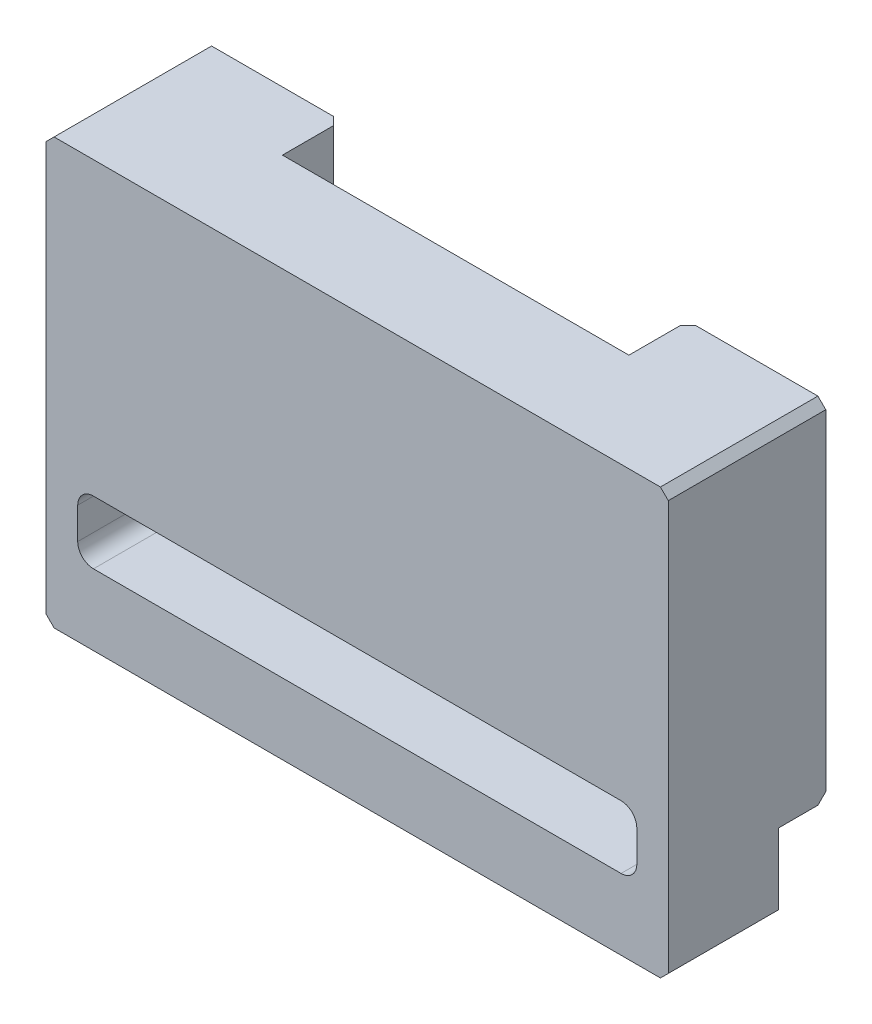
ISO-10303-21;
HEADER;
FILE_DESCRIPTION(('STEP AP214'),'2;1');
FILE_NAME('part.step','',(''),(''),'','','');
FILE_SCHEMA(('AUTOMOTIVE_DESIGN { 1 0 10303 214 1 1 1 1 }'));
ENDSEC;
DATA;
#1=APPLICATION_CONTEXT('core data for automotive mechanical design processes');
#2=APPLICATION_PROTOCOL_DEFINITION('international standard','automotive_design',2000,#1);
#3=PRODUCT_CONTEXT('',#1,'mechanical');
#4=PRODUCT('Part','Part','',(#3));
#5=PRODUCT_RELATED_PRODUCT_CATEGORY('part','',(#4));
#6=PRODUCT_DEFINITION_FORMATION('','',#4);
#7=PRODUCT_DEFINITION_CONTEXT('part definition',#1,'design');
#8=PRODUCT_DEFINITION('design','',#6,#7);
#9=PRODUCT_DEFINITION_SHAPE('','',#8);
#10=(LENGTH_UNIT() NAMED_UNIT(*) SI_UNIT(.MILLI.,.METRE.));
#11=(NAMED_UNIT(*) PLANE_ANGLE_UNIT() SI_UNIT($,.RADIAN.));
#12=(NAMED_UNIT(*) SI_UNIT($,.STERADIAN.) SOLID_ANGLE_UNIT());
#13=UNCERTAINTY_MEASURE_WITH_UNIT(LENGTH_MEASURE(1.E-05),#10,'distance_accuracy_value','');
#14=(GEOMETRIC_REPRESENTATION_CONTEXT(3) GLOBAL_UNCERTAINTY_ASSIGNED_CONTEXT((#13)) GLOBAL_UNIT_ASSIGNED_CONTEXT((#10,
#11,#12)) REPRESENTATION_CONTEXT('',''));
#15=CARTESIAN_POINT('',(0.,0.,0.));
#16=DIRECTION('',(0.,0.,1.));
#17=DIRECTION('',(1.,0.,0.));
#18=AXIS2_PLACEMENT_3D('',#15,#16,#17);
#19=CARTESIAN_POINT('',(0.,0.,-15.));
#20=DIRECTION('',(0.,0.,1.));
#21=DIRECTION('',(1.,0.,0.));
#22=AXIS2_PLACEMENT_3D('',#19,#20,#21);
#23=PLANE('',#22);
#24=DIRECTION('',(0.,1.,0.));
#25=VECTOR('',#24,1.);
#26=CARTESIAN_POINT('',(-56.5,-32.,-15.));
#27=LINE('',#26,#25);
#28=CARTESIAN_POINT('',(-56.5,-38.,-15.));
#29=VERTEX_POINT('',#28);
#30=CARTESIAN_POINT('',(-56.5,-34.,-15.));
#31=VERTEX_POINT('',#30);
#32=EDGE_CURVE('E292',#29,#31,#27,.T.);
#33=ORIENTED_EDGE('',*,*,#32,.F.);
#34=DIRECTION('',(-1.,0.,0.));
#35=VECTOR('',#34,1.);
#36=CARTESIAN_POINT('',(0.,-38.,-15.));
#37=LINE('',#36,#35);
#38=CARTESIAN_POINT('',(-60.5,-38.,-15.));
#39=VERTEX_POINT('',#38);
#40=EDGE_CURVE('E437',#29,#39,#37,.T.);
#41=ORIENTED_EDGE('',*,*,#40,.T.);
#42=DIRECTION('',(0.,-1.,0.));
#43=VECTOR('',#42,1.);
#44=CARTESIAN_POINT('',(-60.5,5.00000000000002,-15.));
#45=LINE('',#44,#43);
#46=CARTESIAN_POINT('',(-60.5,4.,-15.));
#47=VERTEX_POINT('',#46);
#48=EDGE_CURVE('E312',#47,#39,#45,.T.);
#49=ORIENTED_EDGE('',*,*,#48,.F.);
#50=DIRECTION('',(-0.707106781186548,-0.707106781186548,0.));
#51=VECTOR('',#50,1.);
#52=CARTESIAN_POINT('',(-59.5,5.00000000000002,-15.));
#53=LINE('',#52,#51);
#54=CARTESIAN_POINT('',(-59.5,5.00000000000002,-15.));
#55=VERTEX_POINT('',#54);
#56=EDGE_CURVE('E428',#47,#55,#53,.F.);
#57=ORIENTED_EDGE('',*,*,#56,.T.);
#58=DIRECTION('',(-1.,0.,0.));
#59=VECTOR('',#58,1.);
#60=CARTESIAN_POINT('',(-60.5,5.00000000000002,-15.));
#61=LINE('',#60,#59);
#62=CARTESIAN_POINT('',(-44.,5.00000000000002,-15.));
#63=VERTEX_POINT('',#62);
#64=EDGE_CURVE('E317',#63,#55,#61,.T.);
#65=ORIENTED_EDGE('',*,*,#64,.F.);
#66=DIRECTION('',(0.,-1.,0.));
#67=VECTOR('',#66,1.);
#68=CARTESIAN_POINT('',(-44.,0.,-15.));
#69=LINE('',#68,#67);
#70=CARTESIAN_POINT('',(-44.,-32.,-15.));
#71=VERTEX_POINT('',#70);
#72=EDGE_CURVE('E392',#63,#71,#69,.T.);
#73=ORIENTED_EDGE('',*,*,#72,.T.);
#74=DIRECTION('',(1.,0.,0.));
#75=VECTOR('',#74,1.);
#76=CARTESIAN_POINT('',(14.5,-32.,-15.));
#77=LINE('',#76,#75);
#78=CARTESIAN_POINT('',(-54.5,-32.,-15.));
#79=VERTEX_POINT('',#78);
#80=EDGE_CURVE('E296',#79,#71,#77,.T.);
#81=ORIENTED_EDGE('',*,*,#80,.F.);
#82=CARTESIAN_POINT('',(-54.5,-34.,-15.));
#83=DIRECTION('',(0.,0.,1.));
#84=DIRECTION('',(1.,0.,0.));
#85=AXIS2_PLACEMENT_3D('',#82,#83,#84);
#86=CIRCLE('',#85,2.);
#87=EDGE_CURVE('E354',#79,#31,#86,.T.);
#88=ORIENTED_EDGE('',*,*,#87,.T.);
#89=EDGE_LOOP('',(#33,#41,#49,#57,#65,#73,#81,#88));
#90=FACE_BOUND('',#89,.T.);
#91=ADVANCED_FACE('F33',(#90),#23,.F.);
#92=CARTESIAN_POINT('',(18.5,-39.,-14.));
#93=DIRECTION('',(0.,1.,0.));
#94=DIRECTION('',(0.,0.,1.));
#95=AXIS2_PLACEMENT_3D('',#92,#93,#94);
#96=PLANE('',#95);
#97=DIRECTION('',(0.,0.,-1.));
#98=VECTOR('',#97,1.);
#99=CARTESIAN_POINT('',(14.752065001221,-39.,-14.));
#100=LINE('',#99,#98);
#101=CARTESIAN_POINT('',(14.752065001221,-39.,-9.));
#102=VERTEX_POINT('',#101);
#103=CARTESIAN_POINT('',(14.752065001221,-39.,-14.));
#104=VERTEX_POINT('',#103);
#105=EDGE_CURVE('E362',#102,#104,#100,.T.);
#106=ORIENTED_EDGE('',*,*,#105,.T.);
#107=DIRECTION('',(1.,0.,0.));
#108=VECTOR('',#107,1.);
#109=CARTESIAN_POINT('',(18.5,-39.,-14.));
#110=LINE('',#109,#108);
#111=CARTESIAN_POINT('',(18.5,-39.,-14.));
#112=VERTEX_POINT('',#111);
#113=EDGE_CURVE('E241',#104,#112,#110,.T.);
#114=ORIENTED_EDGE('',*,*,#113,.T.);
#115=DIRECTION('',(0.,0.,-1.));
#116=VECTOR('',#115,1.);
#117=CARTESIAN_POINT('',(18.5,-39.,-14.));
#118=LINE('',#117,#116);
#119=CARTESIAN_POINT('',(18.5,-39.,-9.));
#120=VERTEX_POINT('',#119);
#121=EDGE_CURVE('E238',#120,#112,#118,.T.);
#122=ORIENTED_EDGE('',*,*,#121,.F.);
#123=DIRECTION('',(1.,0.,0.));
#124=VECTOR('',#123,1.);
#125=CARTESIAN_POINT('',(14.5,-39.,-9.));
#126=LINE('',#125,#124);
#127=EDGE_CURVE('E223',#102,#120,#126,.T.);
#128=ORIENTED_EDGE('',*,*,#127,.F.);
#129=EDGE_LOOP('',(#106,#114,#122,#128));
#130=FACE_BOUND('',#129,.T.);
#131=ADVANCED_FACE('F239',(#130),#96,.F.);
#132=CARTESIAN_POINT('',(-60.5,5.00000000000002,-15.));
#133=DIRECTION('',(-1.,0.,0.));
#134=DIRECTION('',(0.,-1.,0.));
#135=AXIS2_PLACEMENT_3D('',#132,#133,#134);
#136=PLANE('',#135);
#137=ORIENTED_EDGE('',*,*,#48,.T.);
#138=DIRECTION('',(0.,0.707106781186552,-0.707106781186543));
#139=VECTOR('',#138,1.);
#140=CARTESIAN_POINT('',(-60.5,-16.4999999999997,-36.5));
#141=LINE('',#140,#139);
#142=CARTESIAN_POINT('',(-60.5,-39.,-14.));
#143=VERTEX_POINT('',#142);
#144=EDGE_CURVE('E439',#39,#143,#141,.F.);
#145=ORIENTED_EDGE('',*,*,#144,.T.);
#146=DIRECTION('',(0.,0.,-1.));
#147=VECTOR('',#146,1.);
#148=CARTESIAN_POINT('',(-60.5,-39.,-14.));
#149=LINE('',#148,#147);
#150=CARTESIAN_POINT('',(-60.5,-39.,-9.));
#151=VERTEX_POINT('',#150);
#152=EDGE_CURVE('E243',#151,#143,#149,.T.);
#153=ORIENTED_EDGE('',*,*,#152,.F.);
#154=DIRECTION('',(0.,1.,0.));
#155=VECTOR('',#154,1.);
#156=CARTESIAN_POINT('',(-60.5,-49.,-9.));
#157=LINE('',#156,#155);
#158=CARTESIAN_POINT('',(-60.5,-48.,-9.));
#159=VERTEX_POINT('',#158);
#160=EDGE_CURVE('E252',#159,#151,#157,.T.);
#161=ORIENTED_EDGE('',*,*,#160,.F.);
#162=DIRECTION('',(0.,0.,1.));
#163=VECTOR('',#162,1.);
#164=CARTESIAN_POINT('',(-60.5,-48.,-15.));
#165=LINE('',#164,#163);
#166=CARTESIAN_POINT('',(-60.5,-48.,5.));
#167=VERTEX_POINT('',#166);
#168=EDGE_CURVE('E423',#159,#167,#165,.T.);
#169=ORIENTED_EDGE('',*,*,#168,.T.);
#170=DIRECTION('',(0.,-1.,0.));
#171=VECTOR('',#170,1.);
#172=CARTESIAN_POINT('',(-60.5,5.00000000000002,5.));
#173=LINE('',#172,#171);
#174=CARTESIAN_POINT('',(-60.5,4.,5.));
#175=VERTEX_POINT('',#174);
#176=EDGE_CURVE('E242',#175,#167,#173,.T.);
#177=ORIENTED_EDGE('',*,*,#176,.F.);
#178=DIRECTION('',(0.,0.,-1.));
#179=VECTOR('',#178,1.);
#180=CARTESIAN_POINT('',(-60.5,4.,-15.));
#181=LINE('',#180,#179);
#182=EDGE_CURVE('E426',#175,#47,#181,.T.);
#183=ORIENTED_EDGE('',*,*,#182,.T.);
#184=EDGE_LOOP('',(#137,#145,#153,#161,#169,#177,#183));
#185=FACE_BOUND('',#184,.T.);
#186=ADVANCED_FACE('F527',(#185),#136,.T.);
#187=CARTESIAN_POINT('',(-60.5,5.00000000000002,-15.));
#188=DIRECTION('',(0.,1.,0.));
#189=DIRECTION('',(0.,0.,1.));
#190=AXIS2_PLACEMENT_3D('',#187,#188,#189);
#191=PLANE('',#190);
#192=DIRECTION('',(-1.,0.,0.));
#193=VECTOR('',#192,1.);
#194=CARTESIAN_POINT('',(-60.5,5.00000000000002,5.));
#195=LINE('',#194,#193);
#196=CARTESIAN_POINT('',(17.5,5.00000000000002,5.));
#197=VERTEX_POINT('',#196);
#198=CARTESIAN_POINT('',(-59.5,5.00000000000001,5.));
#199=VERTEX_POINT('',#198);
#200=EDGE_CURVE('E309',#197,#199,#195,.T.);
#201=ORIENTED_EDGE('',*,*,#200,.F.);
#202=DIRECTION('',(0.,0.,-1.));
#203=VECTOR('',#202,1.);
#204=CARTESIAN_POINT('',(17.5,5.00000000000002,-15.));
#205=LINE('',#204,#203);
#206=CARTESIAN_POINT('',(17.5,5.00000000000002,-15.));
#207=VERTEX_POINT('',#206);
#208=EDGE_CURVE('E409',#197,#207,#205,.T.);
#209=ORIENTED_EDGE('',*,*,#208,.T.);
#210=CARTESIAN_POINT('',(2.,5.00000000000002,-15.));
#211=VERTEX_POINT('',#210);
#212=EDGE_CURVE('E318',#207,#211,#61,.T.);
#213=ORIENTED_EDGE('',*,*,#212,.T.);
#214=DIRECTION('',(0.707106781186552,0.,-0.707106781186543));
#215=VECTOR('',#214,1.);
#216=CARTESIAN_POINT('',(-29.2500000000004,5.00000000000002,16.25));
#217=LINE('',#216,#215);
#218=CARTESIAN_POINT('',(1.,5.00000000000002,-14.));
#219=VERTEX_POINT('',#218);
#220=EDGE_CURVE('E387',#211,#219,#217,.F.);
#221=ORIENTED_EDGE('',*,*,#220,.T.);
#222=DIRECTION('',(0.,0.,1.));
#223=VECTOR('',#222,1.);
#224=CARTESIAN_POINT('',(1.,5.00000000000002,-15.));
#225=LINE('',#224,#223);
#226=CARTESIAN_POINT('',(1.,5.00000000000002,-7.5));
#227=VERTEX_POINT('',#226);
#228=EDGE_CURVE('E287',#219,#227,#225,.T.);
#229=ORIENTED_EDGE('',*,*,#228,.T.);
#230=DIRECTION('',(1.,0.,0.));
#231=VECTOR('',#230,1.);
#232=CARTESIAN_POINT('',(-43.,5.00000000000002,-7.5));
#233=LINE('',#232,#231);
#234=CARTESIAN_POINT('',(-43.,5.00000000000002,-7.5));
#235=VERTEX_POINT('',#234);
#236=EDGE_CURVE('E269',#235,#227,#233,.T.);
#237=ORIENTED_EDGE('',*,*,#236,.F.);
#238=DIRECTION('',(0.,0.,-1.));
#239=VECTOR('',#238,1.);
#240=CARTESIAN_POINT('',(-43.,5.00000000000002,-12.5));
#241=LINE('',#240,#239);
#242=CARTESIAN_POINT('',(-43.,5.00000000000002,-14.));
#243=VERTEX_POINT('',#242);
#244=EDGE_CURVE('E284',#235,#243,#241,.T.);
#245=ORIENTED_EDGE('',*,*,#244,.T.);
#246=DIRECTION('',(0.707106781186552,0.,0.707106781186543));
#247=VECTOR('',#246,1.);
#248=CARTESIAN_POINT('',(-52.2500000000001,5.00000000000002,-23.25));
#249=LINE('',#248,#247);
#250=EDGE_CURVE('E385',#243,#63,#249,.F.);
#251=ORIENTED_EDGE('',*,*,#250,.T.);
#252=ORIENTED_EDGE('',*,*,#64,.T.);
#253=DIRECTION('',(0.,0.,1.));
#254=VECTOR('',#253,1.);
#255=CARTESIAN_POINT('',(-59.5,5.00000000000002,-15.));
#256=LINE('',#255,#254);
#257=EDGE_CURVE('E406',#55,#199,#256,.T.);
#258=ORIENTED_EDGE('',*,*,#257,.T.);
#259=EDGE_LOOP('',(#201,#209,#213,#221,#229,#237,#245,#251,#252,#258));
#260=FACE_BOUND('',#259,.T.);
#261=ADVANCED_FACE('F499',(#260),#191,.T.);
#262=CARTESIAN_POINT('',(18.5,5.00000000000002,-15.));
#263=DIRECTION('',(1.,0.,0.));
#264=DIRECTION('',(0.,1.,0.));
#265=AXIS2_PLACEMENT_3D('',#262,#263,#264);
#266=PLANE('',#265);
#267=ORIENTED_EDGE('',*,*,#121,.T.);
#268=DIRECTION('',(0.,-0.707106781186552,0.707106781186543));
#269=VECTOR('',#268,1.);
#270=CARTESIAN_POINT('',(18.5,-16.4999999999997,-36.5));
#271=LINE('',#270,#269);
#272=CARTESIAN_POINT('',(18.5,-38.,-15.));
#273=VERTEX_POINT('',#272);
#274=EDGE_CURVE('E55',#112,#273,#271,.F.);
#275=ORIENTED_EDGE('',*,*,#274,.T.);
#276=DIRECTION('',(0.,1.,0.));
#277=VECTOR('',#276,1.);
#278=CARTESIAN_POINT('',(18.5,5.00000000000002,-15.));
#279=LINE('',#278,#277);
#280=CARTESIAN_POINT('',(18.5,4.00000000000002,-15.));
#281=VERTEX_POINT('',#280);
#282=EDGE_CURVE('E315',#273,#281,#279,.T.);
#283=ORIENTED_EDGE('',*,*,#282,.T.);
#284=DIRECTION('',(0.,0.,1.));
#285=VECTOR('',#284,1.);
#286=CARTESIAN_POINT('',(18.5,4.00000000000002,-15.));
#287=LINE('',#286,#285);
#288=CARTESIAN_POINT('',(18.5,4.00000000000001,5.));
#289=VERTEX_POINT('',#288);
#290=EDGE_CURVE('E395',#281,#289,#287,.T.);
#291=ORIENTED_EDGE('',*,*,#290,.T.);
#292=DIRECTION('',(0.,1.,0.));
#293=VECTOR('',#292,1.);
#294=CARTESIAN_POINT('',(18.5,5.00000000000002,5.));
#295=LINE('',#294,#293);
#296=CARTESIAN_POINT('',(18.5,-48.,5.));
#297=VERTEX_POINT('',#296);
#298=EDGE_CURVE('E306',#297,#289,#295,.T.);
#299=ORIENTED_EDGE('',*,*,#298,.F.);
#300=DIRECTION('',(0.,0.,-1.));
#301=VECTOR('',#300,1.);
#302=CARTESIAN_POINT('',(18.5,-48.,-15.));
#303=LINE('',#302,#301);
#304=CARTESIAN_POINT('',(18.5,-48.,-9.));
#305=VERTEX_POINT('',#304);
#306=EDGE_CURVE('E248',#297,#305,#303,.T.);
#307=ORIENTED_EDGE('',*,*,#306,.T.);
#308=DIRECTION('',(0.,-1.,0.));
#309=VECTOR('',#308,1.);
#310=CARTESIAN_POINT('',(18.5,-39.,-9.));
#311=LINE('',#310,#309);
#312=EDGE_CURVE('E227',#120,#305,#311,.T.);
#313=ORIENTED_EDGE('',*,*,#312,.F.);
#314=EDGE_LOOP('',(#267,#275,#283,#291,#299,#307,#313));
#315=FACE_BOUND('',#314,.T.);
#316=ADVANCED_FACE('F245',(#315),#266,.T.);
#317=CARTESIAN_POINT('',(-60.5,-49.,-15.));
#318=DIRECTION('',(0.,-1.,0.));
#319=DIRECTION('',(0.,0.,-1.));
#320=AXIS2_PLACEMENT_3D('',#317,#318,#319);
#321=PLANE('',#320);
#322=DIRECTION('',(-1.,0.,0.));
#323=VECTOR('',#322,1.);
#324=CARTESIAN_POINT('',(18.5,-49.,-9.));
#325=LINE('',#324,#323);
#326=CARTESIAN_POINT('',(17.5,-49.,-9.));
#327=VERTEX_POINT('',#326);
#328=CARTESIAN_POINT('',(-59.5,-49.,-9.));
#329=VERTEX_POINT('',#328);
#330=EDGE_CURVE('E249',#327,#329,#325,.T.);
#331=ORIENTED_EDGE('',*,*,#330,.F.);
#332=DIRECTION('',(0.,0.,1.));
#333=VECTOR('',#332,1.);
#334=CARTESIAN_POINT('',(17.5,-49.,-15.));
#335=LINE('',#334,#333);
#336=CARTESIAN_POINT('',(17.5,-49.,5.));
#337=VERTEX_POINT('',#336);
#338=EDGE_CURVE('E416',#327,#337,#335,.T.);
#339=ORIENTED_EDGE('',*,*,#338,.T.);
#340=DIRECTION('',(1.,0.,0.));
#341=VECTOR('',#340,1.);
#342=CARTESIAN_POINT('',(-60.5,-49.,5.));
#343=LINE('',#342,#341);
#344=CARTESIAN_POINT('',(-59.5,-49.,5.));
#345=VERTEX_POINT('',#344);
#346=EDGE_CURVE('E303',#345,#337,#343,.T.);
#347=ORIENTED_EDGE('',*,*,#346,.F.);
#348=DIRECTION('',(0.,0.,-1.));
#349=VECTOR('',#348,1.);
#350=CARTESIAN_POINT('',(-59.5,-49.,-15.));
#351=LINE('',#350,#349);
#352=EDGE_CURVE('E414',#345,#329,#351,.T.);
#353=ORIENTED_EDGE('',*,*,#352,.T.);
#354=EDGE_LOOP('',(#331,#339,#347,#353));
#355=FACE_BOUND('',#354,.T.);
#356=ADVANCED_FACE('F538',(#355),#321,.T.);
#357=ORIENTED_EDGE('',*,*,#282,.F.);
#358=DIRECTION('',(-1.,0.,0.));
#359=VECTOR('',#358,1.);
#360=CARTESIAN_POINT('',(0.,-38.,-15.));
#361=LINE('',#360,#359);
#362=CARTESIAN_POINT('',(14.5,-38.,-15.));
#363=VERTEX_POINT('',#362);
#364=EDGE_CURVE('E443',#273,#363,#361,.T.);
#365=ORIENTED_EDGE('',*,*,#364,.T.);
#366=DIRECTION('',(0.,-1.,0.));
#367=VECTOR('',#366,1.);
#368=CARTESIAN_POINT('',(14.5,-32.,-15.));
#369=LINE('',#368,#367);
#370=CARTESIAN_POINT('',(14.5,-34.,-15.));
#371=VERTEX_POINT('',#370);
#372=EDGE_CURVE('E289',#371,#363,#369,.T.);
#373=ORIENTED_EDGE('',*,*,#372,.F.);
#374=CARTESIAN_POINT('',(12.5,-34.,-15.));
#375=DIRECTION('',(0.,0.,1.));
#376=DIRECTION('',(1.,0.,0.));
#377=AXIS2_PLACEMENT_3D('',#374,#375,#376);
#378=CIRCLE('',#377,2.);
#379=CARTESIAN_POINT('',(12.5,-32.,-15.));
#380=VERTEX_POINT('',#379);
#381=EDGE_CURVE('E349',#371,#380,#378,.T.);
#382=ORIENTED_EDGE('',*,*,#381,.T.);
#383=CARTESIAN_POINT('',(2.,-32.,-15.));
#384=VERTEX_POINT('',#383);
#385=EDGE_CURVE('E295',#384,#380,#77,.T.);
#386=ORIENTED_EDGE('',*,*,#385,.F.);
#387=DIRECTION('',(0.,1.,0.));
#388=VECTOR('',#387,1.);
#389=CARTESIAN_POINT('',(2.,0.,-15.));
#390=LINE('',#389,#388);
#391=EDGE_CURVE('E382',#384,#211,#390,.T.);
#392=ORIENTED_EDGE('',*,*,#391,.T.);
#393=ORIENTED_EDGE('',*,*,#212,.F.);
#394=DIRECTION('',(-0.707106781186548,0.707106781186548,0.));
#395=VECTOR('',#394,1.);
#396=CARTESIAN_POINT('',(18.5,4.00000000000002,-15.));
#397=LINE('',#396,#395);
#398=EDGE_CURVE('E411',#207,#281,#397,.F.);
#399=ORIENTED_EDGE('',*,*,#398,.T.);
#400=EDGE_LOOP('',(#357,#365,#373,#382,#386,#392,#393,#399));
#401=FACE_BOUND('',#400,.T.);
#402=ADVANCED_FACE('F447',(#401),#23,.F.);
#403=CARTESIAN_POINT('',(0.,0.,5.));
#404=DIRECTION('',(0.,0.,1.));
#405=DIRECTION('',(1.,0.,0.));
#406=AXIS2_PLACEMENT_3D('',#403,#404,#405);
#407=PLANE('',#406);
#408=DIRECTION('',(0.,1.,0.));
#409=VECTOR('',#408,1.);
#410=CARTESIAN_POINT('',(-56.5,-40.,5.));
#411=LINE('',#410,#409);
#412=CARTESIAN_POINT('',(-56.5,-38.,5.));
#413=VERTEX_POINT('',#412);
#414=CARTESIAN_POINT('',(-56.5,-34.,5.));
#415=VERTEX_POINT('',#414);
#416=EDGE_CURVE('E281',#413,#415,#411,.T.);
#417=ORIENTED_EDGE('',*,*,#416,.T.);
#418=CARTESIAN_POINT('',(-54.5,-34.,5.));
#419=DIRECTION('',(0.,0.,1.));
#420=DIRECTION('',(1.,0.,0.));
#421=AXIS2_PLACEMENT_3D('',#418,#419,#420);
#422=CIRCLE('',#421,2.);
#423=CARTESIAN_POINT('',(-54.5,-32.,5.));
#424=VERTEX_POINT('',#423);
#425=EDGE_CURVE('E356',#415,#424,#422,.F.);
#426=ORIENTED_EDGE('',*,*,#425,.T.);
#427=DIRECTION('',(1.,0.,0.));
#428=VECTOR('',#427,1.);
#429=CARTESIAN_POINT('',(-56.5,-32.,5.));
#430=LINE('',#429,#428);
#431=CARTESIAN_POINT('',(12.5,-32.,5.));
#432=VERTEX_POINT('',#431);
#433=EDGE_CURVE('E272',#424,#432,#430,.T.);
#434=ORIENTED_EDGE('',*,*,#433,.T.);
#435=CARTESIAN_POINT('',(12.5,-34.,5.));
#436=DIRECTION('',(0.,0.,1.));
#437=DIRECTION('',(1.,0.,0.));
#438=AXIS2_PLACEMENT_3D('',#435,#436,#437);
#439=CIRCLE('',#438,2.);
#440=CARTESIAN_POINT('',(14.5,-34.,5.));
#441=VERTEX_POINT('',#440);
#442=EDGE_CURVE('E352',#432,#441,#439,.F.);
#443=ORIENTED_EDGE('',*,*,#442,.T.);
#444=DIRECTION('',(0.,-1.,0.));
#445=VECTOR('',#444,1.);
#446=CARTESIAN_POINT('',(14.5,-32.,5.));
#447=LINE('',#446,#445);
#448=CARTESIAN_POINT('',(14.5,-38.,5.));
#449=VERTEX_POINT('',#448);
#450=EDGE_CURVE('E275',#441,#449,#447,.T.);
#451=ORIENTED_EDGE('',*,*,#450,.T.);
#452=CARTESIAN_POINT('',(12.5,-38.,5.));
#453=DIRECTION('',(0.,0.,1.));
#454=DIRECTION('',(1.,0.,0.));
#455=AXIS2_PLACEMENT_3D('',#452,#453,#454);
#456=CIRCLE('',#455,2.);
#457=CARTESIAN_POINT('',(12.5,-40.,5.));
#458=VERTEX_POINT('',#457);
#459=EDGE_CURVE('E347',#449,#458,#456,.F.);
#460=ORIENTED_EDGE('',*,*,#459,.T.);
#461=DIRECTION('',(-1.,0.,0.));
#462=VECTOR('',#461,1.);
#463=CARTESIAN_POINT('',(14.5,-40.,5.));
#464=LINE('',#463,#462);
#465=CARTESIAN_POINT('',(-54.5,-40.,5.));
#466=VERTEX_POINT('',#465);
#467=EDGE_CURVE('E278',#458,#466,#464,.T.);
#468=ORIENTED_EDGE('',*,*,#467,.T.);
#469=CARTESIAN_POINT('',(-54.5,-38.,5.));
#470=DIRECTION('',(0.,0.,1.));
#471=DIRECTION('',(1.,0.,0.));
#472=AXIS2_PLACEMENT_3D('',#469,#470,#471);
#473=CIRCLE('',#472,2.);
#474=EDGE_CURVE('E360',#466,#413,#473,.F.);
#475=ORIENTED_EDGE('',*,*,#474,.T.);
#476=EDGE_LOOP('',(#417,#426,#434,#443,#451,#460,#468,#475));
#477=FACE_BOUND('',#476,.T.);
#478=ORIENTED_EDGE('',*,*,#298,.T.);
#479=DIRECTION('',(0.707106781186548,-0.707106781186548,0.));
#480=VECTOR('',#479,1.);
#481=CARTESIAN_POINT('',(11.25,11.25,5.));
#482=LINE('',#481,#480);
#483=EDGE_CURVE('E404',#289,#197,#482,.F.);
#484=ORIENTED_EDGE('',*,*,#483,.T.);
#485=ORIENTED_EDGE('',*,*,#200,.T.);
#486=DIRECTION('',(0.707106781186548,0.707106781186548,0.));
#487=VECTOR('',#486,1.);
#488=CARTESIAN_POINT('',(-32.25,32.25,5.));
#489=LINE('',#488,#487);
#490=EDGE_CURVE('E400',#199,#175,#489,.F.);
#491=ORIENTED_EDGE('',*,*,#490,.T.);
#492=ORIENTED_EDGE('',*,*,#176,.T.);
#493=DIRECTION('',(-0.707106781186552,0.707106781186543,0.));
#494=VECTOR('',#493,1.);
#495=CARTESIAN_POINT('',(-54.2499999999996,-54.2500000000003,5.));
#496=LINE('',#495,#494);
#497=EDGE_CURVE('E398',#167,#345,#496,.F.);
#498=ORIENTED_EDGE('',*,*,#497,.T.);
#499=ORIENTED_EDGE('',*,*,#346,.T.);
#500=DIRECTION('',(-0.707106781186543,-0.707106781186552,0.));
#501=VECTOR('',#500,1.);
#502=CARTESIAN_POINT('',(33.2500000000001,-33.2499999999997,5.));
#503=LINE('',#502,#501);
#504=EDGE_CURVE('E402',#337,#297,#503,.F.);
#505=ORIENTED_EDGE('',*,*,#504,.T.);
#506=EDGE_LOOP('',(#478,#484,#485,#491,#492,#498,#499,#505));
#507=FACE_BOUND('',#506,.T.);
#508=ADVANCED_FACE('F471',(#477,#507),#407,.T.);
#509=ORIENTED_EDGE('',*,*,#152,.T.);
#510=DIRECTION('',(1.,0.,0.));
#511=VECTOR('',#510,1.);
#512=CARTESIAN_POINT('',(18.5,-39.,-14.));
#513=LINE('',#512,#511);
#514=CARTESIAN_POINT('',(-56.752065001221,-39.,-14.));
#515=VERTEX_POINT('',#514);
#516=EDGE_CURVE('E430',#143,#515,#513,.T.);
#517=ORIENTED_EDGE('',*,*,#516,.T.);
#518=DIRECTION('',(0.,0.,1.));
#519=VECTOR('',#518,1.);
#520=CARTESIAN_POINT('',(-56.752065001221,-39.,-14.));
#521=LINE('',#520,#519);
#522=CARTESIAN_POINT('',(-56.752065001221,-39.,-9.));
#523=VERTEX_POINT('',#522);
#524=EDGE_CURVE('E366',#515,#523,#521,.T.);
#525=ORIENTED_EDGE('',*,*,#524,.T.);
#526=DIRECTION('',(1.,0.,0.));
#527=VECTOR('',#526,1.);
#528=CARTESIAN_POINT('',(-60.5,-39.,-9.));
#529=LINE('',#528,#527);
#530=EDGE_CURVE('E257',#151,#523,#529,.T.);
#531=ORIENTED_EDGE('',*,*,#530,.F.);
#532=EDGE_LOOP('',(#509,#517,#525,#531));
#533=FACE_BOUND('',#532,.T.);
#534=ADVANCED_FACE('F562',(#533),#96,.F.);
#535=CARTESIAN_POINT('',(14.5,-32.,0.));
#536=DIRECTION('',(1.,0.,0.));
#537=DIRECTION('',(0.,0.,-1.));
#538=AXIS2_PLACEMENT_3D('',#535,#536,#537);
#539=PLANE('',#538);
#540=ORIENTED_EDGE('',*,*,#372,.T.);
#541=DIRECTION('',(0.,0.,-1.));
#542=VECTOR('',#541,1.);
#543=CARTESIAN_POINT('',(14.5,-38.,5.));
#544=LINE('',#543,#542);
#545=EDGE_CURVE('E333',#363,#449,#544,.F.);
#546=ORIENTED_EDGE('',*,*,#545,.T.);
#547=ORIENTED_EDGE('',*,*,#450,.F.);
#548=DIRECTION('',(0.,0.,-1.));
#549=VECTOR('',#548,1.);
#550=CARTESIAN_POINT('',(14.5,-34.,-15.));
#551=LINE('',#550,#549);
#552=EDGE_CURVE('E330',#441,#371,#551,.T.);
#553=ORIENTED_EDGE('',*,*,#552,.T.);
#554=EDGE_LOOP('',(#540,#546,#547,#553));
#555=FACE_BOUND('',#554,.T.);
#556=ADVANCED_FACE('F450',(#555),#539,.F.);
#557=CARTESIAN_POINT('',(-56.5,-32.,0.));
#558=DIRECTION('',(-1.,0.,0.));
#559=DIRECTION('',(0.,0.,1.));
#560=AXIS2_PLACEMENT_3D('',#557,#558,#559);
#561=PLANE('',#560);
#562=ORIENTED_EDGE('',*,*,#32,.T.);
#563=DIRECTION('',(0.,0.,-1.));
#564=VECTOR('',#563,1.);
#565=CARTESIAN_POINT('',(-56.5,-34.,5.));
#566=LINE('',#565,#564);
#567=EDGE_CURVE('E343',#31,#415,#566,.F.);
#568=ORIENTED_EDGE('',*,*,#567,.T.);
#569=ORIENTED_EDGE('',*,*,#416,.F.);
#570=DIRECTION('',(0.,0.,-1.));
#571=VECTOR('',#570,1.);
#572=CARTESIAN_POINT('',(-56.5,-38.,-9.));
#573=LINE('',#572,#571);
#574=EDGE_CURVE('E340',#413,#29,#573,.T.);
#575=ORIENTED_EDGE('',*,*,#574,.T.);
#576=EDGE_LOOP('',(#562,#568,#569,#575));
#577=FACE_BOUND('',#576,.T.);
#578=ADVANCED_FACE('F475',(#577),#561,.F.);
#579=CARTESIAN_POINT('',(14.5,-40.,0.));
#580=DIRECTION('',(0.,-1.,0.));
#581=DIRECTION('',(0.,0.,-1.));
#582=AXIS2_PLACEMENT_3D('',#579,#580,#581);
#583=PLANE('',#582);
#584=ORIENTED_EDGE('',*,*,#467,.F.);
#585=DIRECTION('',(0.,0.,-1.));
#586=VECTOR('',#585,1.);
#587=CARTESIAN_POINT('',(12.5,-40.,-9.));
#588=LINE('',#587,#586);
#589=CARTESIAN_POINT('',(12.5,-40.,-9.));
#590=VERTEX_POINT('',#589);
#591=EDGE_CURVE('E327',#458,#590,#588,.T.);
#592=ORIENTED_EDGE('',*,*,#591,.T.);
#593=DIRECTION('',(1.,0.,0.));
#594=VECTOR('',#593,1.);
#595=CARTESIAN_POINT('',(-56.5,-40.,-9.));
#596=LINE('',#595,#594);
#597=CARTESIAN_POINT('',(-54.5,-40.,-9.));
#598=VERTEX_POINT('',#597);
#599=EDGE_CURVE('E235',#598,#590,#596,.T.);
#600=ORIENTED_EDGE('',*,*,#599,.F.);
#601=DIRECTION('',(0.,0.,-1.));
#602=VECTOR('',#601,1.);
#603=CARTESIAN_POINT('',(-54.5,-40.,5.));
#604=LINE('',#603,#602);
#605=EDGE_CURVE('E325',#598,#466,#604,.F.);
#606=ORIENTED_EDGE('',*,*,#605,.T.);
#607=EDGE_LOOP('',(#584,#592,#600,#606));
#608=FACE_BOUND('',#607,.T.);
#609=ADVANCED_FACE('F464',(#608),#583,.F.);
#610=CARTESIAN_POINT('',(14.5,-32.,0.));
#611=DIRECTION('',(0.,1.,0.));
#612=DIRECTION('',(0.,0.,1.));
#613=AXIS2_PLACEMENT_3D('',#610,#611,#612);
#614=PLANE('',#613);
#615=DIRECTION('',(0.,0.,-1.));
#616=VECTOR('',#615,1.);
#617=CARTESIAN_POINT('',(0.999999999999999,-32.,0.));
#618=LINE('',#617,#616);
#619=CARTESIAN_POINT('',(1.,-32.,-7.5));
#620=VERTEX_POINT('',#619);
#621=CARTESIAN_POINT('',(0.999999999999999,-32.,-14.));
#622=VERTEX_POINT('',#621);
#623=EDGE_CURVE('E322',#620,#622,#618,.T.);
#624=ORIENTED_EDGE('',*,*,#623,.T.);
#625=DIRECTION('',(-0.707106781186552,0.,0.707106781186543));
#626=VECTOR('',#625,1.);
#627=CARTESIAN_POINT('',(1.,-32.,-14.));
#628=LINE('',#627,#626);
#629=EDGE_CURVE('E380',#622,#384,#628,.F.);
#630=ORIENTED_EDGE('',*,*,#629,.T.);
#631=ORIENTED_EDGE('',*,*,#385,.T.);
#632=DIRECTION('',(0.,0.,-1.));
#633=VECTOR('',#632,1.);
#634=CARTESIAN_POINT('',(12.5,-32.,5.));
#635=LINE('',#634,#633);
#636=EDGE_CURVE('E338',#380,#432,#635,.F.);
#637=ORIENTED_EDGE('',*,*,#636,.T.);
#638=ORIENTED_EDGE('',*,*,#433,.F.);
#639=DIRECTION('',(0.,0.,-1.));
#640=VECTOR('',#639,1.);
#641=CARTESIAN_POINT('',(-54.5,-32.,-15.));
#642=LINE('',#641,#640);
#643=EDGE_CURVE('E335',#424,#79,#642,.T.);
#644=ORIENTED_EDGE('',*,*,#643,.T.);
#645=ORIENTED_EDGE('',*,*,#80,.T.);
#646=DIRECTION('',(-0.707106781186552,0.,-0.707106781186543));
#647=VECTOR('',#646,1.);
#648=CARTESIAN_POINT('',(-43.,-32.,-14.));
#649=LINE('',#648,#647);
#650=CARTESIAN_POINT('',(-43.,-32.,-14.));
#651=VERTEX_POINT('',#650);
#652=EDGE_CURVE('E378',#71,#651,#649,.F.);
#653=ORIENTED_EDGE('',*,*,#652,.T.);
#654=DIRECTION('',(0.,0.,1.));
#655=VECTOR('',#654,1.);
#656=CARTESIAN_POINT('',(-43.,-32.,0.));
#657=LINE('',#656,#655);
#658=CARTESIAN_POINT('',(-43.,-32.,-7.5));
#659=VERTEX_POINT('',#658);
#660=EDGE_CURVE('E320',#651,#659,#657,.T.);
#661=ORIENTED_EDGE('',*,*,#660,.T.);
#662=DIRECTION('',(-1.,0.,0.));
#663=VECTOR('',#662,1.);
#664=CARTESIAN_POINT('',(1.,-32.,-7.5));
#665=LINE('',#664,#663);
#666=EDGE_CURVE('E263',#620,#659,#665,.T.);
#667=ORIENTED_EDGE('',*,*,#666,.F.);
#668=EDGE_LOOP('',(#624,#630,#631,#637,#638,#644,#645,#653,#661,#667));
#669=FACE_BOUND('',#668,.T.);
#670=ADVANCED_FACE('F484',(#669),#614,.F.);
#671=CARTESIAN_POINT('',(1.,-34.,-12.5));
#672=DIRECTION('',(1.,0.,0.));
#673=DIRECTION('',(0.,0.,-1.));
#674=AXIS2_PLACEMENT_3D('',#671,#672,#673);
#675=PLANE('',#674);
#676=ORIENTED_EDGE('',*,*,#228,.F.);
#677=DIRECTION('',(0.,-1.,0.));
#678=VECTOR('',#677,1.);
#679=CARTESIAN_POINT('',(1.,-34.,-14.));
#680=LINE('',#679,#678);
#681=EDGE_CURVE('E375',#219,#622,#680,.T.);
#682=ORIENTED_EDGE('',*,*,#681,.T.);
#683=ORIENTED_EDGE('',*,*,#623,.F.);
#684=DIRECTION('',(0.,-1.,0.));
#685=VECTOR('',#684,1.);
#686=CARTESIAN_POINT('',(1.,5.00000000000002,-7.5));
#687=LINE('',#686,#685);
#688=EDGE_CURVE('E260',#227,#620,#687,.T.);
#689=ORIENTED_EDGE('',*,*,#688,.F.);
#690=EDGE_LOOP('',(#676,#682,#683,#689));
#691=FACE_BOUND('',#690,.T.);
#692=ADVANCED_FACE('F503',(#691),#675,.F.);
#693=CARTESIAN_POINT('',(-43.,-34.,-12.5));
#694=DIRECTION('',(-1.,0.,0.));
#695=DIRECTION('',(0.,0.,1.));
#696=AXIS2_PLACEMENT_3D('',#693,#694,#695);
#697=PLANE('',#696);
#698=ORIENTED_EDGE('',*,*,#660,.F.);
#699=DIRECTION('',(0.,1.,0.));
#700=VECTOR('',#699,1.);
#701=CARTESIAN_POINT('',(-43.,-34.,-14.));
#702=LINE('',#701,#700);
#703=EDGE_CURVE('E389',#651,#243,#702,.T.);
#704=ORIENTED_EDGE('',*,*,#703,.T.);
#705=ORIENTED_EDGE('',*,*,#244,.F.);
#706=DIRECTION('',(0.,1.,0.));
#707=VECTOR('',#706,1.);
#708=CARTESIAN_POINT('',(-43.,-32.,-7.5));
#709=LINE('',#708,#707);
#710=EDGE_CURVE('E266',#659,#235,#709,.T.);
#711=ORIENTED_EDGE('',*,*,#710,.F.);
#712=EDGE_LOOP('',(#698,#704,#705,#711));
#713=FACE_BOUND('',#712,.T.);
#714=ADVANCED_FACE('F512',(#713),#697,.F.);
#715=CARTESIAN_POINT('',(0.,0.,-7.5));
#716=DIRECTION('',(0.,0.,-1.));
#717=DIRECTION('',(-1.,0.,0.));
#718=AXIS2_PLACEMENT_3D('',#715,#716,#717);
#719=PLANE('',#718);
#720=ORIENTED_EDGE('',*,*,#688,.T.);
#721=ORIENTED_EDGE('',*,*,#666,.T.);
#722=ORIENTED_EDGE('',*,*,#710,.T.);
#723=ORIENTED_EDGE('',*,*,#236,.T.);
#724=EDGE_LOOP('',(#720,#721,#722,#723));
#725=FACE_BOUND('',#724,.T.);
#726=ADVANCED_FACE('F506',(#725),#719,.T.);
#727=CARTESIAN_POINT('',(0.,0.,-9.));
#728=DIRECTION('',(0.,0.,1.));
#729=DIRECTION('',(1.,0.,0.));
#730=AXIS2_PLACEMENT_3D('',#727,#728,#729);
#731=PLANE('',#730);
#732=ORIENTED_EDGE('',*,*,#312,.T.);
#733=DIRECTION('',(0.707106781186543,0.707106781186552,0.));
#734=VECTOR('',#733,1.);
#735=CARTESIAN_POINT('',(17.5,-49.,-9.));
#736=LINE('',#735,#734);
#737=EDGE_CURVE('E421',#305,#327,#736,.F.);
#738=ORIENTED_EDGE('',*,*,#737,.T.);
#739=ORIENTED_EDGE('',*,*,#330,.T.);
#740=DIRECTION('',(0.707106781186552,-0.707106781186543,0.));
#741=VECTOR('',#740,1.);
#742=CARTESIAN_POINT('',(-60.5,-48.,-9.));
#743=LINE('',#742,#741);
#744=EDGE_CURVE('E419',#329,#159,#743,.F.);
#745=ORIENTED_EDGE('',*,*,#744,.T.);
#746=ORIENTED_EDGE('',*,*,#160,.T.);
#747=ORIENTED_EDGE('',*,*,#530,.T.);
#748=DIRECTION('',(-0.329000404716427,-0.944329780159679,0.));
#749=VECTOR('',#748,1.);
#750=CARTESIAN_POINT('',(-38.4924393056721,13.4105991107759,-9.));
#751=LINE('',#750,#749);
#752=CARTESIAN_POINT('',(-56.4859924629148,-38.2362920592096,-9.));
#753=VERTEX_POINT('',#752);
#754=EDGE_CURVE('E372',#523,#753,#751,.F.);
#755=ORIENTED_EDGE('',*,*,#754,.T.);
#756=CARTESIAN_POINT('',(-54.5,-38.,-9.));
#757=DIRECTION('',(0.,0.,1.));
#758=DIRECTION('',(1.,0.,0.));
#759=AXIS2_PLACEMENT_3D('',#756,#757,#758);
#760=CIRCLE('',#759,2.);
#761=EDGE_CURVE('E358',#753,#598,#760,.T.);
#762=ORIENTED_EDGE('',*,*,#761,.T.);
#763=ORIENTED_EDGE('',*,*,#599,.T.);
#764=CARTESIAN_POINT('',(12.5,-38.,-9.));
#765=DIRECTION('',(0.,0.,1.));
#766=DIRECTION('',(1.,0.,0.));
#767=AXIS2_PLACEMENT_3D('',#764,#765,#766);
#768=CIRCLE('',#767,2.);
#769=CARTESIAN_POINT('',(14.4859924629148,-38.2362920592096,-9.));
#770=VERTEX_POINT('',#769);
#771=EDGE_CURVE('E345',#590,#770,#768,.T.);
#772=ORIENTED_EDGE('',*,*,#771,.T.);
#773=DIRECTION('',(0.329000404716419,-0.944329780159682,0.));
#774=VECTOR('',#773,1.);
#775=CARTESIAN_POINT('',(1.03857249042251,0.361834156727079,-9.));
#776=LINE('',#775,#774);
#777=EDGE_CURVE('E231',#770,#102,#776,.T.);
#778=ORIENTED_EDGE('',*,*,#777,.T.);
#779=ORIENTED_EDGE('',*,*,#127,.T.);
#780=EDGE_LOOP('',(#732,#738,#739,#745,#746,#747,#755,#762,#763,#772,#778,#779));
#781=FACE_BOUND('',#780,.T.);
#782=ADVANCED_FACE('F225',(#781),#731,.F.);
#783=CARTESIAN_POINT('',(12.5,-38.,0.));
#784=DIRECTION('',(0.,0.,1.));
#785=DIRECTION('',(1.,0.,0.));
#786=AXIS2_PLACEMENT_3D('',#783,#784,#785);
#787=CYLINDRICAL_SURFACE('',#786,2.);
#788=ORIENTED_EDGE('',*,*,#545,.F.);
#789=CARTESIAN_POINT('',(12.5,-38.,-15.));
#790=DIRECTION('',(0.,0.707106781186543,0.707106781186552));
#791=DIRECTION('',(0.,-0.707106781186552,0.707106781186543));
#792=AXIS2_PLACEMENT_3D('',#789,#790,#791);
#793=ELLIPSE('',#792,2.82842712474617,2.);
#794=CARTESIAN_POINT('',(14.4859924629148,-38.2362920592096,-14.7637079407904));
#795=VERTEX_POINT('',#794);
#796=EDGE_CURVE('E41',#363,#795,#793,.F.);
#797=ORIENTED_EDGE('',*,*,#796,.T.);
#798=DIRECTION('',(0.,0.,1.));
#799=VECTOR('',#798,1.);
#800=CARTESIAN_POINT('',(14.4859924629148,-38.2362920592096,0.));
#801=LINE('',#800,#799);
#802=EDGE_CURVE('E364',#795,#770,#801,.T.);
#803=ORIENTED_EDGE('',*,*,#802,.T.);
#804=ORIENTED_EDGE('',*,*,#771,.F.);
#805=ORIENTED_EDGE('',*,*,#591,.F.);
#806=ORIENTED_EDGE('',*,*,#459,.F.);
#807=EDGE_LOOP('',(#788,#797,#803,#804,#805,#806));
#808=FACE_BOUND('',#807,.T.);
#809=ADVANCED_FACE('F454',(#808),#787,.F.);
#810=CARTESIAN_POINT('',(12.5,-34.,0.));
#811=DIRECTION('',(0.,0.,1.));
#812=DIRECTION('',(1.,0.,0.));
#813=AXIS2_PLACEMENT_3D('',#810,#811,#812);
#814=CYLINDRICAL_SURFACE('',#813,2.);
#815=ORIENTED_EDGE('',*,*,#442,.F.);
#816=ORIENTED_EDGE('',*,*,#636,.F.);
#817=ORIENTED_EDGE('',*,*,#381,.F.);
#818=ORIENTED_EDGE('',*,*,#552,.F.);
#819=EDGE_LOOP('',(#815,#816,#817,#818));
#820=FACE_BOUND('',#819,.T.);
#821=ADVANCED_FACE('F489',(#820),#814,.F.);
#822=CARTESIAN_POINT('',(-54.5,-34.,0.));
#823=DIRECTION('',(0.,0.,1.));
#824=DIRECTION('',(1.,0.,0.));
#825=AXIS2_PLACEMENT_3D('',#822,#823,#824);
#826=CYLINDRICAL_SURFACE('',#825,2.);
#827=ORIENTED_EDGE('',*,*,#425,.F.);
#828=ORIENTED_EDGE('',*,*,#567,.F.);
#829=ORIENTED_EDGE('',*,*,#87,.F.);
#830=ORIENTED_EDGE('',*,*,#643,.F.);
#831=EDGE_LOOP('',(#827,#828,#829,#830));
#832=FACE_BOUND('',#831,.T.);
#833=ADVANCED_FACE('F479',(#832),#826,.F.);
#834=CARTESIAN_POINT('',(-54.5,-38.,0.));
#835=DIRECTION('',(0.,0.,1.));
#836=DIRECTION('',(1.,0.,0.));
#837=AXIS2_PLACEMENT_3D('',#834,#835,#836);
#838=CYLINDRICAL_SURFACE('',#837,2.);
#839=DIRECTION('',(0.,0.,1.));
#840=VECTOR('',#839,1.);
#841=CARTESIAN_POINT('',(-56.4859924629148,-38.2362920592096,0.));
#842=LINE('',#841,#840);
#843=CARTESIAN_POINT('',(-56.4859924629148,-38.2362920592096,-14.7637079407904));
#844=VERTEX_POINT('',#843);
#845=EDGE_CURVE('E368',#753,#844,#842,.F.);
#846=ORIENTED_EDGE('',*,*,#845,.T.);
#847=CARTESIAN_POINT('',(-54.5,-38.,-15.));
#848=DIRECTION('',(0.,0.707106781186543,0.707106781186552));
#849=DIRECTION('',(0.,-0.707106781186552,0.707106781186543));
#850=AXIS2_PLACEMENT_3D('',#847,#848,#849);
#851=ELLIPSE('',#850,2.82842712474617,2.);
#852=EDGE_CURVE('E435',#844,#29,#851,.F.);
#853=ORIENTED_EDGE('',*,*,#852,.T.);
#854=ORIENTED_EDGE('',*,*,#574,.F.);
#855=ORIENTED_EDGE('',*,*,#474,.F.);
#856=ORIENTED_EDGE('',*,*,#605,.F.);
#857=ORIENTED_EDGE('',*,*,#761,.F.);
#858=EDGE_LOOP('',(#846,#853,#854,#855,#856,#857));
#859=FACE_BOUND('',#858,.T.);
#860=ADVANCED_FACE('F467',(#859),#838,.F.);
#861=CARTESIAN_POINT('',(14.752065001221,-39.,0.));
#862=DIRECTION('',(-0.944329780159681,-0.329000404716419,0.));
#863=DIRECTION('',(0.,0.,1.));
#864=AXIS2_PLACEMENT_3D('',#861,#862,#863);
#865=PLANE('',#864);
#866=ORIENTED_EDGE('',*,*,#802,.F.);
#867=DIRECTION('',(-0.23920131253562,0.686579468117584,-0.686579468117575));
#868=VECTOR('',#867,1.);
#869=CARTESIAN_POINT('',(17.0512949402932,-45.5994791245686,-7.40052087543144));
#870=LINE('',#869,#868);
#871=EDGE_CURVE('E11',#795,#104,#870,.F.);
#872=ORIENTED_EDGE('',*,*,#871,.T.);
#873=ORIENTED_EDGE('',*,*,#105,.F.);
#874=ORIENTED_EDGE('',*,*,#777,.F.);
#875=EDGE_LOOP('',(#866,#872,#873,#874));
#876=FACE_BOUND('',#875,.T.);
#877=ADVANCED_FACE('F458',(#876),#865,.T.);
#878=CARTESIAN_POINT('',(-56.752065001221,-39.,0.));
#879=DIRECTION('',(-0.944329780159679,0.329000404716427,0.));
#880=DIRECTION('',(0.,0.,1.));
#881=AXIS2_PLACEMENT_3D('',#878,#879,#880);
#882=PLANE('',#881);
#883=ORIENTED_EDGE('',*,*,#524,.F.);
#884=DIRECTION('',(0.239201312535626,0.686579468117583,-0.686579468117574));
#885=VECTOR('',#884,1.);
#886=CARTESIAN_POINT('',(-59.0512949402933,-45.5994791245686,-7.40052087543146));
#887=LINE('',#886,#885);
#888=EDGE_CURVE('E433',#515,#844,#887,.T.);
#889=ORIENTED_EDGE('',*,*,#888,.T.);
#890=ORIENTED_EDGE('',*,*,#845,.F.);
#891=ORIENTED_EDGE('',*,*,#754,.F.);
#892=EDGE_LOOP('',(#883,#889,#890,#891));
#893=FACE_BOUND('',#892,.T.);
#894=ADVANCED_FACE('F590',(#893),#882,.F.);
#895=CARTESIAN_POINT('',(1.,-34.,-14.));
#896=DIRECTION('',(0.707106781186543,0.,0.707106781186552));
#897=DIRECTION('',(0.,-1.,0.));
#898=AXIS2_PLACEMENT_3D('',#895,#896,#897);
#899=PLANE('',#898);
#900=ORIENTED_EDGE('',*,*,#220,.F.);
#901=ORIENTED_EDGE('',*,*,#391,.F.);
#902=ORIENTED_EDGE('',*,*,#629,.F.);
#903=ORIENTED_EDGE('',*,*,#681,.F.);
#904=EDGE_LOOP('',(#900,#901,#902,#903));
#905=FACE_BOUND('',#904,.T.);
#906=ADVANCED_FACE('F494',(#905),#899,.F.);
#907=CARTESIAN_POINT('',(-43.,-34.,-14.));
#908=DIRECTION('',(-0.707106781186543,0.,0.707106781186552));
#909=DIRECTION('',(0.,1.,0.));
#910=AXIS2_PLACEMENT_3D('',#907,#908,#909);
#911=PLANE('',#910);
#912=ORIENTED_EDGE('',*,*,#652,.F.);
#913=ORIENTED_EDGE('',*,*,#72,.F.);
#914=ORIENTED_EDGE('',*,*,#250,.F.);
#915=ORIENTED_EDGE('',*,*,#703,.F.);
#916=EDGE_LOOP('',(#912,#913,#914,#915));
#917=FACE_BOUND('',#916,.T.);
#918=ADVANCED_FACE('F516',(#917),#911,.F.);
#919=CARTESIAN_POINT('',(18.5,4.00000000000002,-15.));
#920=DIRECTION('',(-0.707106781186547,-0.707106781186547,0.));
#921=DIRECTION('',(0.,0.,1.));
#922=AXIS2_PLACEMENT_3D('',#919,#920,#921);
#923=PLANE('',#922);
#924=ORIENTED_EDGE('',*,*,#398,.F.);
#925=ORIENTED_EDGE('',*,*,#208,.F.);
#926=ORIENTED_EDGE('',*,*,#483,.F.);
#927=ORIENTED_EDGE('',*,*,#290,.F.);
#928=EDGE_LOOP('',(#924,#925,#926,#927));
#929=FACE_BOUND('',#928,.T.);
#930=ADVANCED_FACE('F545',(#929),#923,.F.);
#931=CARTESIAN_POINT('',(17.5,-49.,-15.));
#932=DIRECTION('',(-0.707106781186552,0.707106781186543,0.));
#933=DIRECTION('',(0.,0.,1.));
#934=AXIS2_PLACEMENT_3D('',#931,#932,#933);
#935=PLANE('',#934);
#936=ORIENTED_EDGE('',*,*,#737,.F.);
#937=ORIENTED_EDGE('',*,*,#306,.F.);
#938=ORIENTED_EDGE('',*,*,#504,.F.);
#939=ORIENTED_EDGE('',*,*,#338,.F.);
#940=EDGE_LOOP('',(#936,#937,#938,#939));
#941=FACE_BOUND('',#940,.T.);
#942=ADVANCED_FACE('F541',(#941),#935,.F.);
#943=CARTESIAN_POINT('',(-59.5,5.00000000000002,-15.));
#944=DIRECTION('',(0.707106781186547,-0.707106781186547,0.));
#945=DIRECTION('',(0.,0.,1.));
#946=AXIS2_PLACEMENT_3D('',#943,#944,#945);
#947=PLANE('',#946);
#948=ORIENTED_EDGE('',*,*,#56,.F.);
#949=ORIENTED_EDGE('',*,*,#182,.F.);
#950=ORIENTED_EDGE('',*,*,#490,.F.);
#951=ORIENTED_EDGE('',*,*,#257,.F.);
#952=EDGE_LOOP('',(#948,#949,#950,#951));
#953=FACE_BOUND('',#952,.T.);
#954=ADVANCED_FACE('F523',(#953),#947,.F.);
#955=CARTESIAN_POINT('',(-60.5,-48.,-15.));
#956=DIRECTION('',(0.707106781186543,0.707106781186552,0.));
#957=DIRECTION('',(0.,0.,1.));
#958=AXIS2_PLACEMENT_3D('',#955,#956,#957);
#959=PLANE('',#958);
#960=ORIENTED_EDGE('',*,*,#744,.F.);
#961=ORIENTED_EDGE('',*,*,#352,.F.);
#962=ORIENTED_EDGE('',*,*,#497,.F.);
#963=ORIENTED_EDGE('',*,*,#168,.F.);
#964=EDGE_LOOP('',(#960,#961,#962,#963));
#965=FACE_BOUND('',#964,.T.);
#966=ADVANCED_FACE('F533',(#965),#959,.F.);
#967=CARTESIAN_POINT('',(18.5,-39.,-14.));
#968=DIRECTION('',(0.,0.707106781186543,0.707106781186552));
#969=DIRECTION('',(1.,0.,0.));
#970=AXIS2_PLACEMENT_3D('',#967,#968,#969);
#971=PLANE('',#970);
#972=ORIENTED_EDGE('',*,*,#144,.F.);
#973=ORIENTED_EDGE('',*,*,#40,.F.);
#974=ORIENTED_EDGE('',*,*,#852,.F.);
#975=ORIENTED_EDGE('',*,*,#888,.F.);
#976=ORIENTED_EDGE('',*,*,#516,.F.);
#977=EDGE_LOOP('',(#972,#973,#974,#975,#976));
#978=FACE_BOUND('',#977,.T.);
#979=ADVANCED_FACE('F733',(#978),#971,.F.);
#980=CARTESIAN_POINT('',(18.5,-39.,-14.));
#981=DIRECTION('',(0.,0.707106781186543,0.707106781186552));
#982=DIRECTION('',(1.,0.,0.));
#983=AXIS2_PLACEMENT_3D('',#980,#981,#982);
#984=PLANE('',#983);
#985=ORIENTED_EDGE('',*,*,#796,.F.);
#986=ORIENTED_EDGE('',*,*,#364,.F.);
#987=ORIENTED_EDGE('',*,*,#274,.F.);
#988=ORIENTED_EDGE('',*,*,#113,.F.);
#989=ORIENTED_EDGE('',*,*,#871,.F.);
#990=EDGE_LOOP('',(#985,#986,#987,#988,#989));
#991=FACE_BOUND('',#990,.T.);
#992=ADVANCED_FACE('F35',(#991),#984,.F.);
#993=CLOSED_SHELL('',(#91,#131,#186,#261,#316,#356,#402,#508,#534,#556,#578,#609,#670,#692,#714,
#726,#782,#809,#821,#833,#860,#877,#894,#906,#918,#930,#942,#954,#966,#979,#992));
#994=MANIFOLD_SOLID_BREP('B2',#993);
#995=ADVANCED_BREP_SHAPE_REPRESENTATION('',(#18,#994),#14);
#996=SHAPE_DEFINITION_REPRESENTATION(#9,#995);
ENDSEC;
END-ISO-10303-21;
